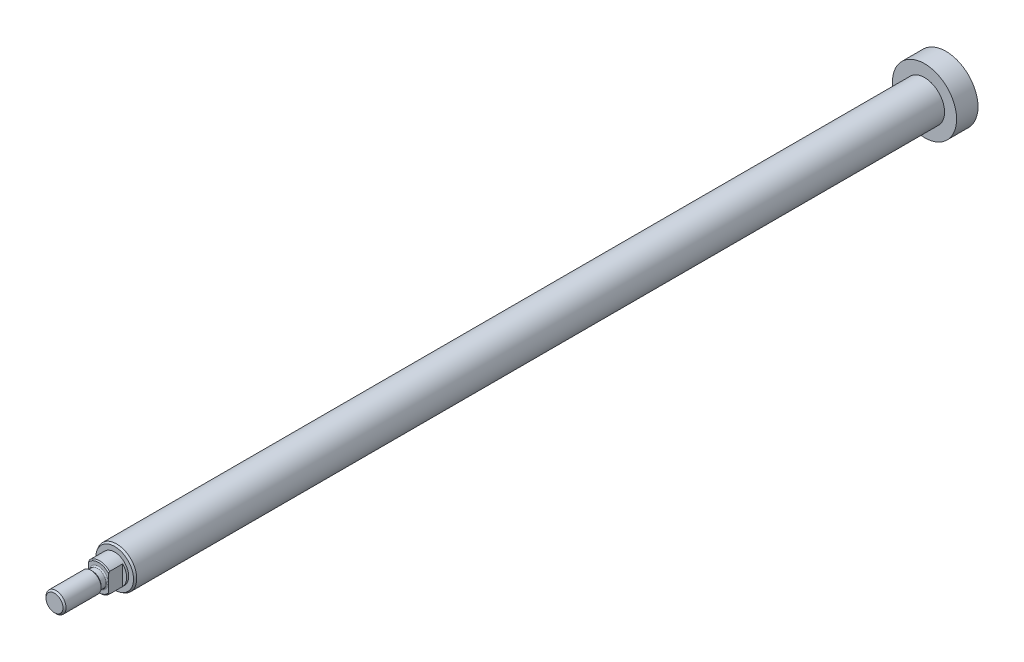
ISO-10303-21;
HEADER;
FILE_DESCRIPTION(('STEP AP214'),'2;1');
FILE_NAME('part.step','',(''),(''),'','','');
FILE_SCHEMA(('AUTOMOTIVE_DESIGN { 1 0 10303 214 1 1 1 1 }'));
ENDSEC;
DATA;
#1=APPLICATION_CONTEXT('core data for automotive mechanical design processes');
#2=APPLICATION_PROTOCOL_DEFINITION('international standard','automotive_design',2000,#1);
#3=PRODUCT_CONTEXT('',#1,'mechanical');
#4=PRODUCT('Part','Part','',(#3));
#5=PRODUCT_RELATED_PRODUCT_CATEGORY('part','',(#4));
#6=PRODUCT_DEFINITION_FORMATION('','',#4);
#7=PRODUCT_DEFINITION_CONTEXT('part definition',#1,'design');
#8=PRODUCT_DEFINITION('design','',#6,#7);
#9=PRODUCT_DEFINITION_SHAPE('','',#8);
#10=(LENGTH_UNIT() NAMED_UNIT(*) SI_UNIT(.MILLI.,.METRE.));
#11=(NAMED_UNIT(*) PLANE_ANGLE_UNIT() SI_UNIT($,.RADIAN.));
#12=(NAMED_UNIT(*) SI_UNIT($,.STERADIAN.) SOLID_ANGLE_UNIT());
#13=UNCERTAINTY_MEASURE_WITH_UNIT(LENGTH_MEASURE(1.E-05),#10,'distance_accuracy_value','');
#14=(GEOMETRIC_REPRESENTATION_CONTEXT(3) GLOBAL_UNCERTAINTY_ASSIGNED_CONTEXT((#13)) GLOBAL_UNIT_ASSIGNED_CONTEXT((#10,
#11,#12)) REPRESENTATION_CONTEXT('',''));
#15=CARTESIAN_POINT('',(0.,0.,0.));
#16=DIRECTION('',(0.,0.,1.));
#17=DIRECTION('',(1.,0.,0.));
#18=AXIS2_PLACEMENT_3D('',#15,#16,#17);
#19=CARTESIAN_POINT('',(0.,0.,25.));
#20=DIRECTION('',(0.,0.,-1.));
#21=DIRECTION('',(-1.,0.,0.));
#22=AXIS2_PLACEMENT_3D('',#19,#20,#21);
#23=CONICAL_SURFACE('',#22,7.,0.785398163397447);
#24=CARTESIAN_POINT('',(0.,0.,25.));
#25=DIRECTION('',(0.,0.,1.));
#26=DIRECTION('',(1.,0.,0.));
#27=AXIS2_PLACEMENT_3D('',#24,#25,#26);
#28=CIRCLE('',#27,7.);
#29=CARTESIAN_POINT('',(5.,4.89897948556636,25.0000000000001));
#30=VERTEX_POINT('',#29);
#31=CARTESIAN_POINT('',(-5.,4.89897948556636,25.0000000000001));
#32=VERTEX_POINT('',#31);
#33=EDGE_CURVE('E119',#30,#32,#28,.T.);
#34=ORIENTED_EDGE('',*,*,#33,.T.);
#35=CARTESIAN_POINT('',(-5.,14.5715866768721,16.5944445643269));
#36=CARTESIAN_POINT('',(-5.,14.3350159964371,16.8182040259703));
#37=CARTESIAN_POINT('',(-5.,14.0981634854665,17.0416658077691));
#38=CARTESIAN_POINT('',(-5.,13.6237974338448,17.487889383726));
#39=CARTESIAN_POINT('',(-5.,13.3862838892593,17.7106511737009));
#40=CARTESIAN_POINT('',(-5.,12.6720896093777,18.3782119192036));
#41=CARTESIAN_POINT('',(-5.,12.1942721996365,18.8217964105246));
#42=CARTESIAN_POINT('',(-5.,11.2152320021286,19.7222650048826));
#43=CARTESIAN_POINT('',(-5.,10.7138407218029,20.1789665570537));
#44=CARTESIAN_POINT('',(-5.,9.95721585203493,20.8584562090151));
#45=CARTESIAN_POINT('',(-5.,9.70437995901182,21.0839132835498));
#46=CARTESIAN_POINT('',(-5.,9.19675406502361,21.532614889009));
#47=CARTESIAN_POINT('',(-5.,8.94196408257241,21.7558594408501));
#48=CARTESIAN_POINT('',(-5.,8.43031600319728,22.1992879689828));
#49=CARTESIAN_POINT('',(-5.,8.17346105957734,22.4194755776956));
#50=CARTESIAN_POINT('',(-5.,7.65674627230289,22.8563298023078));
#51=CARTESIAN_POINT('',(-5.,7.39688628112257,23.072996244077));
#52=CARTESIAN_POINT('',(-5.,6.87251663962868,23.502427455428));
#53=CARTESIAN_POINT('',(-5.,6.60799449073244,23.7151770179856));
#54=CARTESIAN_POINT('',(-5.,6.07409025330038,24.134427523751));
#55=CARTESIAN_POINT('',(-5.,5.80470888168619,24.3409293768924));
#56=CARTESIAN_POINT('',(-5.,5.26465104853764,24.7416069633258));
#57=CARTESIAN_POINT('',(-5.,4.99409330729899,24.935941105521));
#58=CARTESIAN_POINT('',(-5.,4.58210347806506,25.2187192774143));
#59=CARTESIAN_POINT('',(-5.,4.44369019993069,25.311560967888));
#60=CARTESIAN_POINT('',(-5.,4.16454306055545,25.4936794712204));
#61=CARTESIAN_POINT('',(-5.,4.0238093660476,25.5829565386506));
#62=CARTESIAN_POINT('',(-5.,3.74048462275438,25.7567014156725));
#63=CARTESIAN_POINT('',(-5.,3.59790851145636,25.8411934934107));
#64=CARTESIAN_POINT('',(-5.,3.30975555430072,26.0049666671089));
#65=CARTESIAN_POINT('',(-5.,3.16417835865769,26.0842471510795));
#66=CARTESIAN_POINT('',(-5.,2.86991071243734,26.2362737986415));
#67=CARTESIAN_POINT('',(-5.,2.72122525952349,26.3090295857445));
#68=CARTESIAN_POINT('',(-5.,2.4202664278319,26.4466413207326));
#69=CARTESIAN_POINT('',(-5.,2.26799447299014,26.511500342787));
#70=CARTESIAN_POINT('',(-5.,2.04002759654545,26.600268966615));
#71=CARTESIAN_POINT('',(-5.,1.96577644199308,26.627905368976));
#72=CARTESIAN_POINT('',(-5.,1.81641132427963,26.6807455908531));
#73=CARTESIAN_POINT('',(-5.,1.74129732759205,26.7059493154852));
#74=CARTESIAN_POINT('',(-5.,1.51464185211048,26.7775867437774));
#75=CARTESIAN_POINT('',(-5.,1.3618080808472,26.8200383234453));
#76=CARTESIAN_POINT('',(-5.,1.05404459524494,26.8922824800316));
#77=CARTESIAN_POINT('',(-5.,0.89913125762099,26.9221441242732));
#78=CARTESIAN_POINT('',(-5.,0.58724641866073,26.9679934339769));
#79=CARTESIAN_POINT('',(-5.,0.430275160935036,26.98398272682));
#80=CARTESIAN_POINT('',(-5.,0.114280475722205,27.0012012730332));
#81=CARTESIAN_POINT('',(-5.,-0.0447494058853687,27.0023143244326));
#82=CARTESIAN_POINT('',(-5.,-0.362181149738554,26.9894094764942));
#83=CARTESIAN_POINT('',(-5.,-0.520583014323721,26.9753916335769));
#84=CARTESIAN_POINT('',(-5.,-0.836147229639818,26.9329922275705));
#85=CARTESIAN_POINT('',(-5.,-0.993300801826583,26.9045463485003));
#86=CARTESIAN_POINT('',(-5.,-1.30471433138325,26.8348068132791));
#87=CARTESIAN_POINT('',(-5.,-1.45897363964478,26.7935103107382));
#88=CARTESIAN_POINT('',(-5.,-1.84899038222965,26.6738698919371));
#89=CARTESIAN_POINT('',(-5.,-2.08233855535092,26.5876973140858));
#90=CARTESIAN_POINT('',(-5.,-2.5406471601927,26.3954067206316));
#91=CARTESIAN_POINT('',(-5.,-2.76560083861273,26.2892730441021));
#92=CARTESIAN_POINT('',(-5.,-3.09840327404383,26.1185913942538));
#93=CARTESIAN_POINT('',(-5.,-3.2090924923537,26.0594682303143));
#94=CARTESIAN_POINT('',(-5.,-3.42870403560793,25.9380177519696));
#95=CARTESIAN_POINT('',(-5.,-3.53762633798415,25.8756903966808));
#96=CARTESIAN_POINT('',(-5.,-3.75380281217204,25.7483272564731));
#97=CARTESIAN_POINT('',(-5.,-3.86105771765276,25.6832927118933));
#98=CARTESIAN_POINT('',(-5.,-4.07409383157646,25.5508688862489));
#99=CARTESIAN_POINT('',(-5.,-4.17987510140111,25.4834797036751));
#100=CARTESIAN_POINT('',(-5.,-4.53447908292759,25.2527422610141));
#101=CARTESIAN_POINT('',(-5.,-4.78025192639633,25.0847002945734));
#102=CARTESIAN_POINT('',(-5.,-5.26600720943082,24.7404161913257));
#103=CARTESIAN_POINT('',(-5.,-5.50598827670177,24.5641721395407));
#104=CARTESIAN_POINT('',(-5.,-5.98154841151707,24.2054798942169));
#105=CARTESIAN_POINT('',(-5.,-6.21712388048376,24.0230269450796));
#106=CARTESIAN_POINT('',(-5.,-6.68460411800921,23.6535363658491));
#107=CARTESIAN_POINT('',(-5.,-6.91650920317085,23.4664991347768));
#108=CARTESIAN_POINT('',(-5.,-7.37816724934039,23.0882214243391));
#109=CARTESIAN_POINT('',(-5.,-7.60791031859103,22.8969688999327));
#110=CARTESIAN_POINT('',(-5.,-8.06500694103635,22.5116262196629));
#111=CARTESIAN_POINT('',(-5.,-8.29236045019361,22.3175360116607));
#112=CARTESIAN_POINT('',(-5.,-8.74500205327033,21.9271679632333));
#113=CARTESIAN_POINT('',(-5.,-8.97029102371197,21.7308911378239));
#114=CARTESIAN_POINT('',(-5.,-9.41924014963472,21.3364822526071));
#115=CARTESIAN_POINT('',(-5.,-9.64290029275372,21.138350178745));
#116=CARTESIAN_POINT('',(-5.,-10.265522522391,20.5829872683824));
#117=CARTESIAN_POINT('',(-5.,-10.6629822373514,20.2240724452031));
#118=CARTESIAN_POINT('',(-5.,-11.4547074899373,19.5026459702472));
#119=CARTESIAN_POINT('',(-5.,-11.8489726171232,19.1401338691982));
#120=CARTESIAN_POINT('',(-5.,-12.632400468018,18.4148736299597));
#121=CARTESIAN_POINT('',(-5.,-13.0215796814397,18.0521432835676));
#122=CARTESIAN_POINT('',(-5.,-13.797939807351,17.324673360944));
#123=CARTESIAN_POINT('',(-5.,-14.1851210292725,16.9599341150971));
#124=CARTESIAN_POINT('',(-5.,-14.5715866768721,16.5944445643269));
#125=B_SPLINE_CURVE_WITH_KNOTS('',3,(#35,#36,#37,#38,#39,#40,#41,#42,#43,#44,#45,#46,#47,#48,
#49,#50,#51,#52,#53,#54,#55,#56,#57,#58,#59,#60,#61,#62,#63,#64,#65,#66,#67,#68,#69,#70,#71,#72,
#73,#74,#75,#76,#77,#78,#79,#80,#81,#82,#83,#84,#85,#86,#87,#88,#89,#90,#91,#92,#93,#94,#95,#96,
#97,#98,#99,#100,#101,#102,#103,#104,#105,#106,#107,#108,#109,#110,#111,#112,#113,#114,#115,
#116,#117,#118,#119,#120,#121,#122,#123,#124),.UNSPECIFIED.,.F.,.F.,(4,2,2,2,2,2,2,2,2,2,2,2,2,
2,2,2,2,2,2,2,2,2,2,2,2,2,2,2,2,2,2,2,2,2,2,2,2,2,2,2,2,2,2,2,4),(0.,0.97688570037098,
1.95377722753853,3.90969678513727,5.94427446993277,6.96053822974641,7.97679237290648,
8.99171268689235,10.0066830393555,11.0249974642002,12.0431628579361,13.0422615193437,
13.5422194698126,14.0421416511313,14.5392464011427,15.0364094215014,15.5328266647861,
16.0290500333001,16.2666953979964,16.5043500280621,16.9797275144331,17.4524620736427,
17.9251411683335,18.4015103366792,18.8778777287332,19.3563875394888,19.8350034148324,
20.5799162464839,21.3254159728049,21.701842513884,22.0782738591352,22.4545345951787,
22.8307796116056,23.723696880987,24.6168236800744,25.5106506726408,26.4044001398842,
27.3011628360096,28.1979420297855,29.0943209850052,29.9907067362831,31.5972680975778,
33.2040326966669,34.8000518062771,36.3958158367395),.UNSPECIFIED.);
#126=CARTESIAN_POINT('',(-5.,4.15331193145907,25.5));
#127=VERTEX_POINT('',#126);
#128=EDGE_CURVE('E131',#32,#127,#125,.T.);
#129=ORIENTED_EDGE('',*,*,#128,.T.);
#130=CARTESIAN_POINT('',(0.,0.,25.5));
#131=DIRECTION('',(0.,0.,1.));
#132=DIRECTION('',(1.,0.,0.));
#133=AXIS2_PLACEMENT_3D('',#130,#131,#132);
#134=CIRCLE('',#133,6.5);
#135=CARTESIAN_POINT('',(5.,4.15331193145907,25.5));
#136=VERTEX_POINT('',#135);
#137=EDGE_CURVE('E104',#136,#127,#134,.T.);
#138=ORIENTED_EDGE('',*,*,#137,.F.);
#139=CARTESIAN_POINT('',(5.,-14.5715866768721,16.5944445643269));
#140=CARTESIAN_POINT('',(5.,-14.3350159964371,16.8182040259703));
#141=CARTESIAN_POINT('',(5.,-14.0981634854665,17.0416658077691));
#142=CARTESIAN_POINT('',(5.,-13.6237974338448,17.487889383726));
#143=CARTESIAN_POINT('',(5.,-13.3862838892593,17.7106511737009));
#144=CARTESIAN_POINT('',(5.,-12.6720896093777,18.3782119192036));
#145=CARTESIAN_POINT('',(5.,-12.1942721996365,18.8217964105246));
#146=CARTESIAN_POINT('',(5.,-11.2152320021286,19.7222650048826));
#147=CARTESIAN_POINT('',(5.,-10.7138407218029,20.1789665570537));
#148=CARTESIAN_POINT('',(5.,-9.95721585203493,20.8584562090151));
#149=CARTESIAN_POINT('',(5.,-9.70437995901182,21.0839132835498));
#150=CARTESIAN_POINT('',(5.,-9.19675406502361,21.532614889009));
#151=CARTESIAN_POINT('',(5.,-8.94196408257241,21.7558594408501));
#152=CARTESIAN_POINT('',(5.,-8.43031600319728,22.1992879689828));
#153=CARTESIAN_POINT('',(5.,-8.17346105957734,22.4194755776956));
#154=CARTESIAN_POINT('',(5.,-7.65674627230289,22.8563298023078));
#155=CARTESIAN_POINT('',(5.,-7.39688628112257,23.072996244077));
#156=CARTESIAN_POINT('',(5.,-6.87251663962868,23.502427455428));
#157=CARTESIAN_POINT('',(5.,-6.60799449073244,23.7151770179856));
#158=CARTESIAN_POINT('',(5.,-6.07409025330038,24.134427523751));
#159=CARTESIAN_POINT('',(5.,-5.80470888168619,24.3409293768924));
#160=CARTESIAN_POINT('',(5.,-5.26465104853764,24.7416069633258));
#161=CARTESIAN_POINT('',(5.,-4.99409330729899,24.935941105521));
#162=CARTESIAN_POINT('',(5.,-4.58210347806506,25.2187192774143));
#163=CARTESIAN_POINT('',(5.,-4.44369019993069,25.311560967888));
#164=CARTESIAN_POINT('',(5.,-4.16454306055545,25.4936794712204));
#165=CARTESIAN_POINT('',(5.,-4.0238093660476,25.5829565386506));
#166=CARTESIAN_POINT('',(5.,-3.74048462275438,25.7567014156725));
#167=CARTESIAN_POINT('',(5.,-3.59790851145636,25.8411934934107));
#168=CARTESIAN_POINT('',(5.,-3.30975555430072,26.0049666671089));
#169=CARTESIAN_POINT('',(5.,-3.16417835865769,26.0842471510795));
#170=CARTESIAN_POINT('',(5.,-2.86991071243734,26.2362737986415));
#171=CARTESIAN_POINT('',(5.,-2.72122525952349,26.3090295857445));
#172=CARTESIAN_POINT('',(5.,-2.4202664278319,26.4466413207326));
#173=CARTESIAN_POINT('',(5.,-2.26799447299014,26.511500342787));
#174=CARTESIAN_POINT('',(5.,-2.04002759654545,26.600268966615));
#175=CARTESIAN_POINT('',(5.,-1.96577644199308,26.627905368976));
#176=CARTESIAN_POINT('',(5.,-1.81641132427963,26.6807455908531));
#177=CARTESIAN_POINT('',(5.,-1.74129732759205,26.7059493154852));
#178=CARTESIAN_POINT('',(5.,-1.51464185211048,26.7775867437774));
#179=CARTESIAN_POINT('',(5.,-1.3618080808472,26.8200383234453));
#180=CARTESIAN_POINT('',(5.,-1.05404459524494,26.8922824800316));
#181=CARTESIAN_POINT('',(5.,-0.89913125762099,26.9221441242732));
#182=CARTESIAN_POINT('',(5.,-0.58724641866073,26.9679934339769));
#183=CARTESIAN_POINT('',(5.,-0.430275160935036,26.98398272682));
#184=CARTESIAN_POINT('',(5.,-0.114280475722205,27.0012012730332));
#185=CARTESIAN_POINT('',(5.,0.0447494058853687,27.0023143244326));
#186=CARTESIAN_POINT('',(5.,0.362181149738554,26.9894094764942));
#187=CARTESIAN_POINT('',(5.,0.520583014323721,26.9753916335769));
#188=CARTESIAN_POINT('',(5.,0.836147229639818,26.9329922275705));
#189=CARTESIAN_POINT('',(5.,0.993300801826583,26.9045463485003));
#190=CARTESIAN_POINT('',(5.,1.30471433138325,26.8348068132791));
#191=CARTESIAN_POINT('',(5.,1.45897363964478,26.7935103107382));
#192=CARTESIAN_POINT('',(5.,1.84899038222965,26.6738698919371));
#193=CARTESIAN_POINT('',(5.,2.08233855535092,26.5876973140858));
#194=CARTESIAN_POINT('',(5.,2.5406471601927,26.3954067206316));
#195=CARTESIAN_POINT('',(5.,2.76560083861273,26.2892730441021));
#196=CARTESIAN_POINT('',(5.,3.09840327404383,26.1185913942538));
#197=CARTESIAN_POINT('',(5.,3.2090924923537,26.0594682303143));
#198=CARTESIAN_POINT('',(5.,3.42870403560793,25.9380177519696));
#199=CARTESIAN_POINT('',(5.,3.53762633798415,25.8756903966808));
#200=CARTESIAN_POINT('',(5.,3.75380281217204,25.7483272564731));
#201=CARTESIAN_POINT('',(5.,3.86105771765276,25.6832927118933));
#202=CARTESIAN_POINT('',(5.,4.07409383157646,25.5508688862489));
#203=CARTESIAN_POINT('',(5.,4.17987510140111,25.4834797036751));
#204=CARTESIAN_POINT('',(5.,4.53447908292759,25.2527422610141));
#205=CARTESIAN_POINT('',(5.,4.78025192639633,25.0847002945734));
#206=CARTESIAN_POINT('',(5.,5.26600720943082,24.7404161913257));
#207=CARTESIAN_POINT('',(5.,5.50598827670177,24.5641721395407));
#208=CARTESIAN_POINT('',(5.,5.98154841151707,24.2054798942169));
#209=CARTESIAN_POINT('',(5.,6.21712388048376,24.0230269450796));
#210=CARTESIAN_POINT('',(5.,6.68460411800921,23.6535363658491));
#211=CARTESIAN_POINT('',(5.,6.91650920317085,23.4664991347768));
#212=CARTESIAN_POINT('',(5.,7.37816724934039,23.0882214243391));
#213=CARTESIAN_POINT('',(5.,7.60791031859103,22.8969688999327));
#214=CARTESIAN_POINT('',(5.,8.06500694103635,22.5116262196629));
#215=CARTESIAN_POINT('',(5.,8.29236045019361,22.3175360116607));
#216=CARTESIAN_POINT('',(5.,8.74500205327033,21.9271679632333));
#217=CARTESIAN_POINT('',(5.,8.97029102371197,21.7308911378239));
#218=CARTESIAN_POINT('',(5.,9.41924014963472,21.3364822526071));
#219=CARTESIAN_POINT('',(5.,9.64290029275372,21.138350178745));
#220=CARTESIAN_POINT('',(5.,10.265522522391,20.5829872683824));
#221=CARTESIAN_POINT('',(5.,10.6629822373514,20.2240724452031));
#222=CARTESIAN_POINT('',(5.,11.4547074899373,19.5026459702472));
#223=CARTESIAN_POINT('',(5.,11.8489726171232,19.1401338691982));
#224=CARTESIAN_POINT('',(5.,12.632400468018,18.4148736299597));
#225=CARTESIAN_POINT('',(5.,13.0215796814397,18.0521432835676));
#226=CARTESIAN_POINT('',(5.,13.797939807351,17.324673360944));
#227=CARTESIAN_POINT('',(5.,14.1851210292725,16.9599341150971));
#228=CARTESIAN_POINT('',(5.,14.5715866768721,16.5944445643269));
#229=B_SPLINE_CURVE_WITH_KNOTS('',3,(#139,#140,#141,#142,#143,#144,#145,#146,#147,#148,#149,
#150,#151,#152,#153,#154,#155,#156,#157,#158,#159,#160,#161,#162,#163,#164,#165,#166,#167,#168,
#169,#170,#171,#172,#173,#174,#175,#176,#177,#178,#179,#180,#181,#182,#183,#184,#185,#186,#187,
#188,#189,#190,#191,#192,#193,#194,#195,#196,#197,#198,#199,#200,#201,#202,#203,#204,#205,#206,
#207,#208,#209,#210,#211,#212,#213,#214,#215,#216,#217,#218,#219,#220,#221,#222,#223,#224,#225,
#226,#227,#228),.UNSPECIFIED.,.F.,.F.,(4,2,2,2,2,2,2,2,2,2,2,2,2,2,2,2,2,2,2,2,2,2,2,2,2,2,2,2,
2,2,2,2,2,2,2,2,2,2,2,2,2,2,2,2,4),(0.,0.97688570037098,1.95377722753853,3.90969678513727,
5.94427446993277,6.96053822974641,7.97679237290648,8.99171268689235,10.0066830393555,
11.0249974642002,12.0431628579361,13.0422615193437,13.5422194698126,14.0421416511313,
14.5392464011427,15.0364094215014,15.5328266647861,16.0290500333001,16.2666953979964,
16.5043500280621,16.9797275144331,17.4524620736427,17.9251411683335,18.4015103366792,
18.8778777287332,19.3563875394888,19.8350034148324,20.5799162464839,21.3254159728049,
21.701842513884,22.0782738591352,22.4545345951787,22.8307796116056,23.723696880987,
24.6168236800744,25.5106506726408,26.4044001398842,27.3011628360096,28.1979420297855,
29.0943209850052,29.9907067362831,31.5972680975778,33.2040326966669,34.8000518062771,
36.3958158367395),.UNSPECIFIED.);
#230=EDGE_CURVE('E133',#136,#30,#229,.T.);
#231=ORIENTED_EDGE('',*,*,#230,.T.);
#232=EDGE_LOOP('',(#34,#129,#138,#231));
#233=FACE_BOUND('',#232,.T.);
#234=ADVANCED_FACE('F47',(#233),#23,.T.);
#235=CARTESIAN_POINT('',(0.,0.,25.5));
#236=DIRECTION('',(0.,0.,-1.));
#237=DIRECTION('',(-1.,0.,0.));
#238=AXIS2_PLACEMENT_3D('',#235,#236,#237);
#239=PLANE('',#238);
#240=CARTESIAN_POINT('',(0.,0.,25.5));
#241=DIRECTION('',(0.,0.,1.));
#242=DIRECTION('',(1.,0.,0.));
#243=AXIS2_PLACEMENT_3D('',#240,#241,#242);
#244=CIRCLE('',#243,4.83299999999992);
#245=CARTESIAN_POINT('',(4.83299999999992,0.,25.5));
#246=VERTEX_POINT('',#245);
#247=EDGE_CURVE('E11',#246,#246,#244,.T.);
#248=ORIENTED_EDGE('',*,*,#247,.F.);
#249=EDGE_LOOP('',(#248));
#250=FACE_BOUND('',#249,.T.);
#251=ORIENTED_EDGE('',*,*,#137,.T.);
#252=DIRECTION('',(0.,1.,0.));
#253=VECTOR('',#252,1.);
#254=CARTESIAN_POINT('',(-5.,-14.,25.5));
#255=LINE('',#254,#253);
#256=CARTESIAN_POINT('',(-5.,-4.15331193145907,25.5));
#257=VERTEX_POINT('',#256);
#258=EDGE_CURVE('E145',#257,#127,#255,.T.);
#259=ORIENTED_EDGE('',*,*,#258,.F.);
#260=CARTESIAN_POINT('',(5.,-4.15331193145907,25.5));
#261=VERTEX_POINT('',#260);
#262=EDGE_CURVE('E134',#257,#261,#134,.T.);
#263=ORIENTED_EDGE('',*,*,#262,.T.);
#264=DIRECTION('',(0.,1.,0.));
#265=VECTOR('',#264,1.);
#266=CARTESIAN_POINT('',(5.,-14.,25.5));
#267=LINE('',#266,#265);
#268=EDGE_CURVE('E110',#261,#136,#267,.T.);
#269=ORIENTED_EDGE('',*,*,#268,.T.);
#270=EDGE_LOOP('',(#251,#259,#263,#269));
#271=FACE_BOUND('',#270,.T.);
#272=ADVANCED_FACE('F49',(#250,#271),#239,.F.);
#273=ORIENTED_EDGE('',*,*,#262,.F.);
#274=CARTESIAN_POINT('',(-5.,-4.89897948556636,25.0000000000001));
#275=VERTEX_POINT('',#274);
#276=EDGE_CURVE('E159',#257,#275,#125,.T.);
#277=ORIENTED_EDGE('',*,*,#276,.T.);
#278=CARTESIAN_POINT('',(5.,-4.89897948556636,25.0000000000001));
#279=VERTEX_POINT('',#278);
#280=EDGE_CURVE('E135',#275,#279,#28,.T.);
#281=ORIENTED_EDGE('',*,*,#280,.T.);
#282=EDGE_CURVE('E158',#279,#261,#229,.T.);
#283=ORIENTED_EDGE('',*,*,#282,.T.);
#284=EDGE_LOOP('',(#273,#277,#281,#283));
#285=FACE_BOUND('',#284,.T.);
#286=ADVANCED_FACE('F166',(#285),#23,.T.);
#287=CARTESIAN_POINT('',(0.,0.,-397.));
#288=DIRECTION('',(0.,0.,1.));
#289=DIRECTION('',(1.,0.,0.));
#290=AXIS2_PLACEMENT_3D('',#287,#288,#289);
#291=CYLINDRICAL_SURFACE('',#290,7.);
#292=CARTESIAN_POINT('',(0.,0.,18.5));
#293=DIRECTION('',(0.,0.,-1.));
#294=DIRECTION('',(-1.,0.,0.));
#295=AXIS2_PLACEMENT_3D('',#292,#293,#294);
#296=CIRCLE('',#295,7.);
#297=CARTESIAN_POINT('',(-5.,-4.89897948556636,18.5));
#298=VERTEX_POINT('',#297);
#299=CARTESIAN_POINT('',(-5.,4.89897948556636,18.5));
#300=VERTEX_POINT('',#299);
#301=EDGE_CURVE('E127',#298,#300,#296,.T.);
#302=ORIENTED_EDGE('',*,*,#301,.T.);
#303=DIRECTION('',(0.,0.,1.));
#304=VECTOR('',#303,1.);
#305=CARTESIAN_POINT('',(-5.,4.89897948556636,-397.));
#306=LINE('',#305,#304);
#307=EDGE_CURVE('E55',#300,#32,#306,.T.);
#308=ORIENTED_EDGE('',*,*,#307,.T.);
#309=ORIENTED_EDGE('',*,*,#33,.F.);
#310=DIRECTION('',(0.,0.,1.));
#311=VECTOR('',#310,1.);
#312=CARTESIAN_POINT('',(5.,4.89897948556636,-397.));
#313=LINE('',#312,#311);
#314=CARTESIAN_POINT('',(5.,4.89897948556636,18.5));
#315=VERTEX_POINT('',#314);
#316=EDGE_CURVE('E103',#30,#315,#313,.F.);
#317=ORIENTED_EDGE('',*,*,#316,.T.);
#318=CARTESIAN_POINT('',(0.,0.,18.5));
#319=DIRECTION('',(0.,0.,-1.));
#320=DIRECTION('',(-1.,0.,0.));
#321=AXIS2_PLACEMENT_3D('',#318,#319,#320);
#322=CIRCLE('',#321,7.);
#323=CARTESIAN_POINT('',(5.,-4.89897948556636,18.5));
#324=VERTEX_POINT('',#323);
#325=EDGE_CURVE('E98',#315,#324,#322,.T.);
#326=ORIENTED_EDGE('',*,*,#325,.T.);
#327=DIRECTION('',(0.,0.,1.));
#328=VECTOR('',#327,1.);
#329=CARTESIAN_POINT('',(5.,-4.89897948556636,-397.));
#330=LINE('',#329,#328);
#331=EDGE_CURVE('E109',#324,#279,#330,.T.);
#332=ORIENTED_EDGE('',*,*,#331,.T.);
#333=ORIENTED_EDGE('',*,*,#280,.F.);
#334=DIRECTION('',(0.,0.,1.));
#335=VECTOR('',#334,1.);
#336=CARTESIAN_POINT('',(-5.,-4.89897948556636,-397.));
#337=LINE('',#336,#335);
#338=EDGE_CURVE('E121',#275,#298,#337,.F.);
#339=ORIENTED_EDGE('',*,*,#338,.T.);
#340=EDGE_LOOP('',(#302,#308,#309,#317,#326,#332,#333,#339));
#341=FACE_BOUND('',#340,.T.);
#342=CARTESIAN_POINT('',(0.,0.,17.5));
#343=DIRECTION('',(0.,0.,1.));
#344=DIRECTION('',(1.,0.,0.));
#345=AXIS2_PLACEMENT_3D('',#342,#343,#344);
#346=CIRCLE('',#345,7.);
#347=CARTESIAN_POINT('',(7.,0.,17.5));
#348=VERTEX_POINT('',#347);
#349=EDGE_CURVE('E139',#348,#348,#346,.T.);
#350=ORIENTED_EDGE('',*,*,#349,.T.);
#351=EDGE_LOOP('',(#350));
#352=FACE_BOUND('',#351,.T.);
#353=ADVANCED_FACE('F115',(#341,#352),#291,.T.);
#354=CARTESIAN_POINT('',(0.,7.,17.5));
#355=DIRECTION('',(0.,0.,-1.));
#356=DIRECTION('',(-1.,0.,0.));
#357=AXIS2_PLACEMENT_3D('',#354,#355,#356);
#358=PLANE('',#357);
#359=ORIENTED_EDGE('',*,*,#349,.F.);
#360=EDGE_LOOP('',(#359));
#361=FACE_BOUND('',#360,.T.);
#362=CARTESIAN_POINT('',(0.,0.,17.5));
#363=DIRECTION('',(0.,0.,1.));
#364=DIRECTION('',(1.,0.,0.));
#365=AXIS2_PLACEMENT_3D('',#362,#363,#364);
#366=CIRCLE('',#365,9.4226497308104);
#367=CARTESIAN_POINT('',(9.4226497308104,0.,17.5));
#368=VERTEX_POINT('',#367);
#369=EDGE_CURVE('E278',#368,#368,#366,.T.);
#370=ORIENTED_EDGE('',*,*,#369,.T.);
#371=EDGE_LOOP('',(#370));
#372=FACE_BOUND('',#371,.T.);
#373=ADVANCED_FACE('F200',(#361,#372),#358,.F.);
#374=CARTESIAN_POINT('',(0.,0.,16.5));
#375=DIRECTION('',(0.,0.,-1.));
#376=DIRECTION('',(-1.,0.,0.));
#377=AXIS2_PLACEMENT_3D('',#374,#375,#376);
#378=CONICAL_SURFACE('',#377,10.,0.523598775598279);
#379=ORIENTED_EDGE('',*,*,#369,.F.);
#380=EDGE_LOOP('',(#379));
#381=FACE_BOUND('',#380,.T.);
#382=CARTESIAN_POINT('',(0.,0.,16.5));
#383=DIRECTION('',(0.,0.,1.));
#384=DIRECTION('',(1.,0.,0.));
#385=AXIS2_PLACEMENT_3D('',#382,#383,#384);
#386=CIRCLE('',#385,10.);
#387=CARTESIAN_POINT('',(10.,0.,16.5));
#388=VERTEX_POINT('',#387);
#389=EDGE_CURVE('E276',#388,#388,#386,.T.);
#390=ORIENTED_EDGE('',*,*,#389,.T.);
#391=EDGE_LOOP('',(#390));
#392=FACE_BOUND('',#391,.T.);
#393=ADVANCED_FACE('F196',(#381,#392),#378,.T.);
#394=CARTESIAN_POINT('',(0.,0.,-397.));
#395=DIRECTION('',(0.,0.,1.));
#396=DIRECTION('',(1.,0.,0.));
#397=AXIS2_PLACEMENT_3D('',#394,#395,#396);
#398=CYLINDRICAL_SURFACE('',#397,10.);
#399=ORIENTED_EDGE('',*,*,#389,.F.);
#400=EDGE_LOOP('',(#399));
#401=FACE_BOUND('',#400,.T.);
#402=CARTESIAN_POINT('',(0.,0.,-386.33333333333));
#403=DIRECTION('',(0.,0.,1.));
#404=DIRECTION('',(1.,0.,0.));
#405=AXIS2_PLACEMENT_3D('',#402,#403,#404);
#406=CIRCLE('',#405,10.);
#407=CARTESIAN_POINT('',(10.,0.,-386.33333333333));
#408=VERTEX_POINT('',#407);
#409=EDGE_CURVE('E271',#408,#408,#406,.T.);
#410=ORIENTED_EDGE('',*,*,#409,.T.);
#411=EDGE_LOOP('',(#410));
#412=FACE_BOUND('',#411,.T.);
#413=ADVANCED_FACE('F192',(#401,#412),#398,.T.);
#414=CARTESIAN_POINT('',(0.,10.,-386.33333333333));
#415=DIRECTION('',(0.,0.,-1.));
#416=DIRECTION('',(-1.,0.,0.));
#417=AXIS2_PLACEMENT_3D('',#414,#415,#416);
#418=PLANE('',#417);
#419=ORIENTED_EDGE('',*,*,#409,.F.);
#420=EDGE_LOOP('',(#419));
#421=FACE_BOUND('',#420,.T.);
#422=CARTESIAN_POINT('',(0.,0.,-386.33333333333));
#423=DIRECTION('',(0.,0.,1.));
#424=DIRECTION('',(1.,0.,0.));
#425=AXIS2_PLACEMENT_3D('',#422,#423,#424);
#426=CIRCLE('',#425,16.);
#427=CARTESIAN_POINT('',(16.,0.,-386.33333333333));
#428=VERTEX_POINT('',#427);
#429=EDGE_CURVE('E267',#428,#428,#426,.T.);
#430=ORIENTED_EDGE('',*,*,#429,.T.);
#431=EDGE_LOOP('',(#430));
#432=FACE_BOUND('',#431,.T.);
#433=ADVANCED_FACE('F188',(#421,#432),#418,.F.);
#434=CARTESIAN_POINT('',(0.,0.,-397.));
#435=DIRECTION('',(0.,0.,1.));
#436=DIRECTION('',(1.,0.,0.));
#437=AXIS2_PLACEMENT_3D('',#434,#435,#436);
#438=CYLINDRICAL_SURFACE('',#437,16.);
#439=ORIENTED_EDGE('',*,*,#429,.F.);
#440=EDGE_LOOP('',(#439));
#441=FACE_BOUND('',#440,.T.);
#442=CARTESIAN_POINT('',(0.,0.,-397.));
#443=DIRECTION('',(0.,0.,1.));
#444=DIRECTION('',(1.,0.,0.));
#445=AXIS2_PLACEMENT_3D('',#442,#443,#444);
#446=CIRCLE('',#445,16.);
#447=CARTESIAN_POINT('',(16.,0.,-397.));
#448=VERTEX_POINT('',#447);
#449=EDGE_CURVE('E265',#448,#448,#446,.T.);
#450=ORIENTED_EDGE('',*,*,#449,.T.);
#451=EDGE_LOOP('',(#450));
#452=FACE_BOUND('',#451,.T.);
#453=ADVANCED_FACE('F184',(#441,#452),#438,.T.);
#454=CARTESIAN_POINT('',(0.,16.,-397.));
#455=DIRECTION('',(0.,0.,1.));
#456=DIRECTION('',(1.,0.,0.));
#457=AXIS2_PLACEMENT_3D('',#454,#455,#456);
#458=PLANE('',#457);
#459=ORIENTED_EDGE('',*,*,#449,.F.);
#460=EDGE_LOOP('',(#459));
#461=FACE_BOUND('',#460,.T.);
#462=ADVANCED_FACE('F178',(#461),#458,.F.);
#463=CARTESIAN_POINT('',(8.,-14.,18.5));
#464=DIRECTION('',(0.,0.,-1.));
#465=DIRECTION('',(-1.,0.,0.));
#466=AXIS2_PLACEMENT_3D('',#463,#464,#465);
#467=PLANE('',#466);
#468=DIRECTION('',(0.,1.,0.));
#469=VECTOR('',#468,1.);
#470=CARTESIAN_POINT('',(5.,-14.,18.5));
#471=LINE('',#470,#469);
#472=EDGE_CURVE('E69',#324,#315,#471,.T.);
#473=ORIENTED_EDGE('',*,*,#472,.F.);
#474=ORIENTED_EDGE('',*,*,#325,.F.);
#475=EDGE_LOOP('',(#473,#474));
#476=FACE_BOUND('',#475,.T.);
#477=ADVANCED_FACE('F99',(#476),#467,.F.);
#478=CARTESIAN_POINT('',(5.,-14.,18.5));
#479=DIRECTION('',(-1.,0.,0.));
#480=DIRECTION('',(0.,0.,1.));
#481=AXIS2_PLACEMENT_3D('',#478,#479,#480);
#482=PLANE('',#481);
#483=ORIENTED_EDGE('',*,*,#331,.F.);
#484=ORIENTED_EDGE('',*,*,#472,.T.);
#485=ORIENTED_EDGE('',*,*,#316,.F.);
#486=ORIENTED_EDGE('',*,*,#230,.F.);
#487=ORIENTED_EDGE('',*,*,#268,.F.);
#488=ORIENTED_EDGE('',*,*,#282,.F.);
#489=EDGE_LOOP('',(#483,#484,#485,#486,#487,#488));
#490=FACE_BOUND('',#489,.T.);
#491=ADVANCED_FACE('F107',(#490),#482,.F.);
#492=CARTESIAN_POINT('',(-5.,-14.,18.5));
#493=DIRECTION('',(0.,0.,-1.));
#494=DIRECTION('',(-1.,0.,0.));
#495=AXIS2_PLACEMENT_3D('',#492,#493,#494);
#496=PLANE('',#495);
#497=DIRECTION('',(0.,1.,0.));
#498=VECTOR('',#497,1.);
#499=CARTESIAN_POINT('',(-5.,-14.,18.5));
#500=LINE('',#499,#498);
#501=EDGE_CURVE('E62',#298,#300,#500,.T.);
#502=ORIENTED_EDGE('',*,*,#501,.T.);
#503=ORIENTED_EDGE('',*,*,#301,.F.);
#504=EDGE_LOOP('',(#502,#503));
#505=FACE_BOUND('',#504,.T.);
#506=ADVANCED_FACE('F172',(#505),#496,.F.);
#507=CARTESIAN_POINT('',(-5.,-14.,25.5));
#508=DIRECTION('',(1.,0.,0.));
#509=DIRECTION('',(0.,0.,-1.));
#510=AXIS2_PLACEMENT_3D('',#507,#508,#509);
#511=PLANE('',#510);
#512=ORIENTED_EDGE('',*,*,#307,.F.);
#513=ORIENTED_EDGE('',*,*,#501,.F.);
#514=ORIENTED_EDGE('',*,*,#338,.F.);
#515=ORIENTED_EDGE('',*,*,#276,.F.);
#516=ORIENTED_EDGE('',*,*,#258,.T.);
#517=ORIENTED_EDGE('',*,*,#128,.F.);
#518=EDGE_LOOP('',(#512,#513,#514,#515,#516,#517));
#519=FACE_BOUND('',#518,.T.);
#520=ADVANCED_FACE('F173',(#519),#511,.F.);
#521=CARTESIAN_POINT('',(0.,0.,26.0999999999999));
#522=DIRECTION('',(0.,0.,1.));
#523=DIRECTION('',(1.,0.,0.));
#524=AXIS2_PLACEMENT_3D('',#521,#522,#523);
#525=TOROIDAL_SURFACE('',#524,4.83299999999992,0.599999999999923);
#526=CARTESIAN_POINT('',(0.,0.,26.1));
#527=DIRECTION('',(0.,0.,1.));
#528=DIRECTION('',(1.,0.,0.));
#529=AXIS2_PLACEMENT_3D('',#526,#527,#528);
#530=CIRCLE('',#529,4.233);
#531=CARTESIAN_POINT('',(4.233,0.,26.1));
#532=VERTEX_POINT('',#531);
#533=EDGE_CURVE('E111',#532,#532,#530,.T.);
#534=ORIENTED_EDGE('',*,*,#533,.F.);
#535=EDGE_LOOP('',(#534));
#536=FACE_BOUND('',#535,.T.);
#537=ORIENTED_EDGE('',*,*,#247,.T.);
#538=EDGE_LOOP('',(#537));
#539=FACE_BOUND('',#538,.T.);
#540=ADVANCED_FACE('F220',(#536,#539),#525,.F.);
#541=CARTESIAN_POINT('',(0.,0.,25.5));
#542=DIRECTION('',(0.,0.,1.));
#543=DIRECTION('',(1.,0.,0.));
#544=AXIS2_PLACEMENT_3D('',#541,#542,#543);
#545=CYLINDRICAL_SURFACE('',#544,4.233);
#546=CARTESIAN_POINT('',(0.,0.,28.5));
#547=DIRECTION('',(0.,0.,1.));
#548=DIRECTION('',(1.,0.,0.));
#549=AXIS2_PLACEMENT_3D('',#546,#547,#548);
#550=CIRCLE('',#549,4.233);
#551=CARTESIAN_POINT('',(4.233,0.,28.5));
#552=VERTEX_POINT('',#551);
#553=EDGE_CURVE('E259',#552,#552,#550,.T.);
#554=ORIENTED_EDGE('',*,*,#553,.F.);
#555=EDGE_LOOP('',(#554));
#556=FACE_BOUND('',#555,.T.);
#557=ORIENTED_EDGE('',*,*,#533,.T.);
#558=EDGE_LOOP('',(#557));
#559=FACE_BOUND('',#558,.T.);
#560=ADVANCED_FACE('F221',(#556,#559),#545,.T.);
#561=CARTESIAN_POINT('',(0.,0.,28.5));
#562=DIRECTION('',(0.,0.,1.));
#563=DIRECTION('',(1.,0.,0.));
#564=AXIS2_PLACEMENT_3D('',#561,#562,#563);
#565=CONICAL_SURFACE('',#564,4.233,0.785398163397448);
#566=CARTESIAN_POINT('',(0.,0.,29.267));
#567=DIRECTION('',(0.,0.,1.));
#568=DIRECTION('',(1.,0.,0.));
#569=AXIS2_PLACEMENT_3D('',#566,#567,#568);
#570=CIRCLE('',#569,5.);
#571=CARTESIAN_POINT('',(5.,0.,29.267));
#572=VERTEX_POINT('',#571);
#573=EDGE_CURVE('E254',#572,#572,#570,.T.);
#574=ORIENTED_EDGE('',*,*,#573,.F.);
#575=EDGE_LOOP('',(#574));
#576=FACE_BOUND('',#575,.T.);
#577=ORIENTED_EDGE('',*,*,#553,.T.);
#578=EDGE_LOOP('',(#577));
#579=FACE_BOUND('',#578,.T.);
#580=ADVANCED_FACE('F227',(#576,#579),#565,.T.);
#581=CARTESIAN_POINT('',(0.,0.,25.5));
#582=DIRECTION('',(0.,0.,1.));
#583=DIRECTION('',(1.,0.,0.));
#584=AXIS2_PLACEMENT_3D('',#581,#582,#583);
#585=CYLINDRICAL_SURFACE('',#584,5.);
#586=CARTESIAN_POINT('',(0.,0.,46.733));
#587=DIRECTION('',(0.,0.,1.));
#588=DIRECTION('',(1.,0.,0.));
#589=AXIS2_PLACEMENT_3D('',#586,#587,#588);
#590=CIRCLE('',#589,5.);
#591=CARTESIAN_POINT('',(5.,0.,46.733));
#592=VERTEX_POINT('',#591);
#593=EDGE_CURVE('E251',#592,#592,#590,.T.);
#594=ORIENTED_EDGE('',*,*,#593,.F.);
#595=EDGE_LOOP('',(#594));
#596=FACE_BOUND('',#595,.T.);
#597=ORIENTED_EDGE('',*,*,#573,.T.);
#598=EDGE_LOOP('',(#597));
#599=FACE_BOUND('',#598,.T.);
#600=ADVANCED_FACE('F235',(#596,#599),#585,.T.);
#601=CARTESIAN_POINT('',(0.,0.,46.733));
#602=DIRECTION('',(0.,0.,-1.));
#603=DIRECTION('',(-1.,0.,0.));
#604=AXIS2_PLACEMENT_3D('',#601,#602,#603);
#605=CONICAL_SURFACE('',#604,5.,0.785398163397446);
#606=CARTESIAN_POINT('',(0.,0.,47.5));
#607=DIRECTION('',(0.,0.,1.));
#608=DIRECTION('',(1.,0.,0.));
#609=AXIS2_PLACEMENT_3D('',#606,#607,#608);
#610=CIRCLE('',#609,4.233);
#611=CARTESIAN_POINT('',(4.233,0.,47.5));
#612=VERTEX_POINT('',#611);
#613=EDGE_CURVE('E250',#612,#612,#610,.T.);
#614=ORIENTED_EDGE('',*,*,#613,.F.);
#615=EDGE_LOOP('',(#614));
#616=FACE_BOUND('',#615,.T.);
#617=ORIENTED_EDGE('',*,*,#593,.T.);
#618=EDGE_LOOP('',(#617));
#619=FACE_BOUND('',#618,.T.);
#620=ADVANCED_FACE('F239',(#616,#619),#605,.T.);
#621=CARTESIAN_POINT('',(0.,0.,47.5));
#622=DIRECTION('',(0.,0.,-1.));
#623=DIRECTION('',(-1.,0.,0.));
#624=AXIS2_PLACEMENT_3D('',#621,#622,#623);
#625=PLANE('',#624);
#626=ORIENTED_EDGE('',*,*,#613,.T.);
#627=EDGE_LOOP('',(#626));
#628=FACE_BOUND('',#627,.T.);
#629=ADVANCED_FACE('F243',(#628),#625,.F.);
#630=CLOSED_SHELL('',(#234,#272,#286,#353,#373,#393,#413,#433,#453,#462,#477,#491,#506,#520,
#540,#560,#580,#600,#620,#629));
#631=MANIFOLD_SOLID_BREP('B2',#630);
#632=ADVANCED_BREP_SHAPE_REPRESENTATION('',(#18,#631),#14);
#633=SHAPE_DEFINITION_REPRESENTATION(#9,#632);
ENDSEC;
END-ISO-10303-21;
